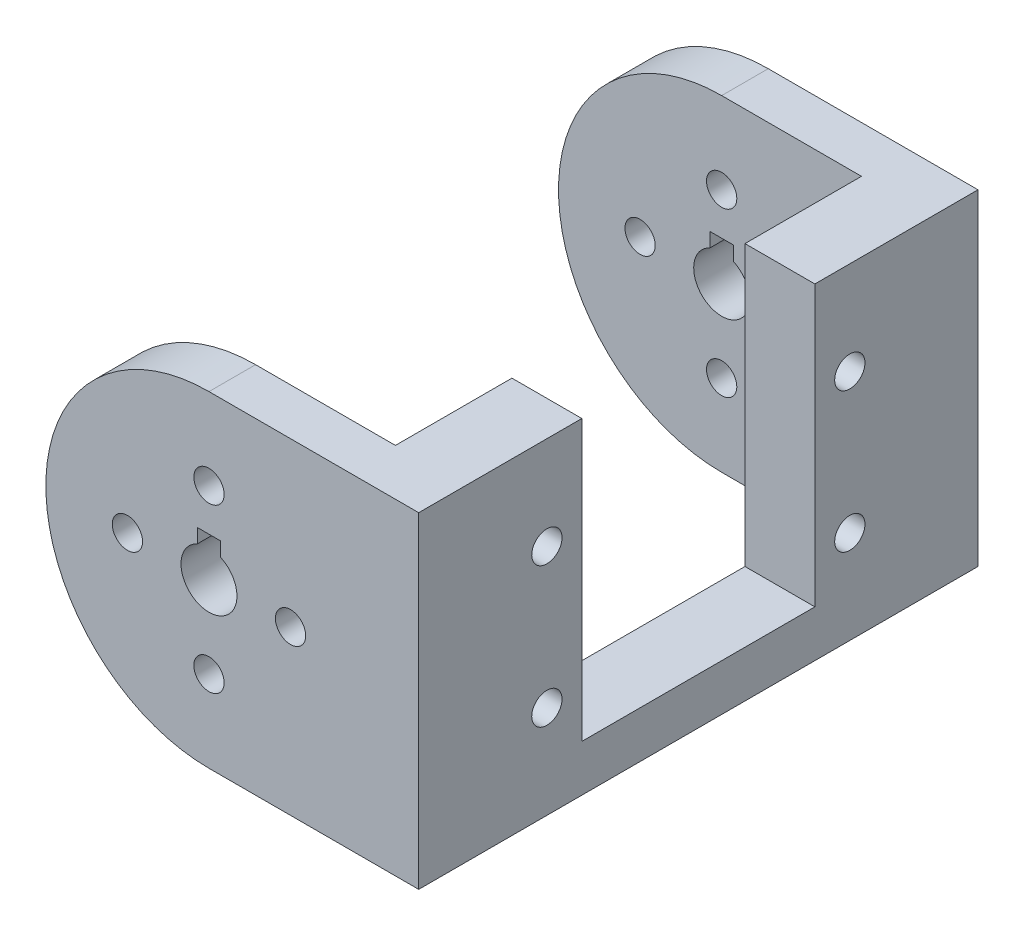
ISO-10303-21;
HEADER;
FILE_DESCRIPTION(('STEP AP214'),'2;1');
FILE_NAME('part.step','',(''),(''),'','','');
FILE_SCHEMA(('AUTOMOTIVE_DESIGN { 1 0 10303 214 1 1 1 1 }'));
ENDSEC;
DATA;
#1=APPLICATION_CONTEXT('core data for automotive mechanical design processes');
#2=APPLICATION_PROTOCOL_DEFINITION('international standard','automotive_design',2000,#1);
#3=PRODUCT_CONTEXT('',#1,'mechanical');
#4=PRODUCT('Part','Part','',(#3));
#5=PRODUCT_RELATED_PRODUCT_CATEGORY('part','',(#4));
#6=PRODUCT_DEFINITION_FORMATION('','',#4);
#7=PRODUCT_DEFINITION_CONTEXT('part definition',#1,'design');
#8=PRODUCT_DEFINITION('design','',#6,#7);
#9=PRODUCT_DEFINITION_SHAPE('','',#8);
#10=(LENGTH_UNIT() NAMED_UNIT(*) SI_UNIT(.MILLI.,.METRE.));
#11=(NAMED_UNIT(*) PLANE_ANGLE_UNIT() SI_UNIT($,.RADIAN.));
#12=(NAMED_UNIT(*) SI_UNIT($,.STERADIAN.) SOLID_ANGLE_UNIT());
#13=UNCERTAINTY_MEASURE_WITH_UNIT(LENGTH_MEASURE(1.E-05),#10,'distance_accuracy_value','');
#14=(GEOMETRIC_REPRESENTATION_CONTEXT(3) GLOBAL_UNCERTAINTY_ASSIGNED_CONTEXT((#13)) GLOBAL_UNIT_ASSIGNED_CONTEXT((#10,
#11,#12)) REPRESENTATION_CONTEXT('',''));
#15=CARTESIAN_POINT('',(0.,0.,0.));
#16=DIRECTION('',(0.,0.,1.));
#17=DIRECTION('',(1.,0.,0.));
#18=AXIS2_PLACEMENT_3D('',#15,#16,#17);
#19=CARTESIAN_POINT('',(0.,35.,0.));
#20=DIRECTION('',(0.,1.,0.));
#21=DIRECTION('',(0.,0.,1.));
#22=AXIS2_PLACEMENT_3D('',#19,#20,#21);
#23=PLANE('',#22);
#24=DIRECTION('',(1.,0.,0.));
#25=VECTOR('',#24,1.);
#26=CARTESIAN_POINT('',(0.,35.,25.));
#27=LINE('',#26,#25);
#28=CARTESIAN_POINT('',(25.,35.,25.));
#29=VERTEX_POINT('',#28);
#30=CARTESIAN_POINT('',(40.,35.,25.));
#31=VERTEX_POINT('',#30);
#32=EDGE_CURVE('E11',#29,#31,#27,.T.);
#33=ORIENTED_EDGE('',*,*,#32,.F.);
#34=DIRECTION('',(0.,0.,-1.));
#35=VECTOR('',#34,1.);
#36=CARTESIAN_POINT('',(25.,35.,0.));
#37=LINE('',#36,#35);
#38=CARTESIAN_POINT('',(25.,35.,50.));
#39=VERTEX_POINT('',#38);
#40=EDGE_CURVE('E394',#39,#29,#37,.T.);
#41=ORIENTED_EDGE('',*,*,#40,.F.);
#42=DIRECTION('',(1.,0.,0.));
#43=VECTOR('',#42,1.);
#44=CARTESIAN_POINT('',(0.,35.,50.));
#45=LINE('',#44,#43);
#46=CARTESIAN_POINT('',(-4.99999999999999,35.,50.));
#47=VERTEX_POINT('',#46);
#48=EDGE_CURVE('E209',#47,#39,#45,.T.);
#49=ORIENTED_EDGE('',*,*,#48,.F.);
#50=DIRECTION('',(0.,0.,-1.));
#51=VECTOR('',#50,1.);
#52=CARTESIAN_POINT('',(-4.99999999999999,35.,50.));
#53=LINE('',#52,#51);
#54=CARTESIAN_POINT('',(-4.99999999999999,35.,60.));
#55=VERTEX_POINT('',#54);
#56=EDGE_CURVE('E241',#47,#55,#53,.F.);
#57=ORIENTED_EDGE('',*,*,#56,.T.);
#58=DIRECTION('',(1.,0.,0.));
#59=VECTOR('',#58,1.);
#60=CARTESIAN_POINT('',(0.,35.,60.));
#61=LINE('',#60,#59);
#62=CARTESIAN_POINT('',(40.,35.,60.));
#63=VERTEX_POINT('',#62);
#64=EDGE_CURVE('E203',#55,#63,#61,.T.);
#65=ORIENTED_EDGE('',*,*,#64,.T.);
#66=DIRECTION('',(0.,0.,1.));
#67=VECTOR('',#66,1.);
#68=CARTESIAN_POINT('',(40.,35.,0.));
#69=LINE('',#68,#67);
#70=EDGE_CURVE('E196',#31,#63,#69,.T.);
#71=ORIENTED_EDGE('',*,*,#70,.F.);
#72=EDGE_LOOP('',(#33,#41,#49,#57,#65,#71));
#73=FACE_BOUND('',#72,.T.);
#74=ADVANCED_FACE('F43',(#73),#23,.T.);
#75=CARTESIAN_POINT('',(-5.,0.,-50.));
#76=DIRECTION('',(0.,0.,1.));
#77=DIRECTION('',(1.,0.,0.));
#78=AXIS2_PLACEMENT_3D('',#75,#76,#77);
#79=CYLINDRICAL_SURFACE('',#78,35.);
#80=DIRECTION('',(0.,0.,1.));
#81=VECTOR('',#80,1.);
#82=CARTESIAN_POINT('',(-5.,-35.,0.));
#83=LINE('',#82,#81);
#84=CARTESIAN_POINT('',(-5.,-35.,-50.));
#85=VERTEX_POINT('',#84);
#86=CARTESIAN_POINT('',(-5.,-35.,-60.));
#87=VERTEX_POINT('',#86);
#88=EDGE_CURVE('E250',#85,#87,#83,.F.);
#89=ORIENTED_EDGE('',*,*,#88,.F.);
#90=CARTESIAN_POINT('',(-5.,0.,-50.));
#91=DIRECTION('',(0.,0.,1.));
#92=DIRECTION('',(1.,0.,0.));
#93=AXIS2_PLACEMENT_3D('',#90,#91,#92);
#94=CIRCLE('',#93,35.);
#95=CARTESIAN_POINT('',(-5.,35.,-50.));
#96=VERTEX_POINT('',#95);
#97=EDGE_CURVE('E256',#96,#85,#94,.T.);
#98=ORIENTED_EDGE('',*,*,#97,.F.);
#99=DIRECTION('',(0.,0.,-1.));
#100=VECTOR('',#99,1.);
#101=CARTESIAN_POINT('',(-5.,35.,-50.));
#102=LINE('',#101,#100);
#103=CARTESIAN_POINT('',(-5.,35.,-60.));
#104=VERTEX_POINT('',#103);
#105=EDGE_CURVE('E253',#104,#96,#102,.F.);
#106=ORIENTED_EDGE('',*,*,#105,.F.);
#107=CARTESIAN_POINT('',(-5.00000000000001,0.,-60.));
#108=DIRECTION('',(0.,0.,-1.));
#109=DIRECTION('',(-1.,0.,0.));
#110=AXIS2_PLACEMENT_3D('',#107,#108,#109);
#111=CIRCLE('',#110,35.);
#112=EDGE_CURVE('E258',#87,#104,#111,.T.);
#113=ORIENTED_EDGE('',*,*,#112,.F.);
#114=EDGE_LOOP('',(#89,#98,#106,#113));
#115=FACE_BOUND('',#114,.T.);
#116=ADVANCED_FACE('F46',(#115),#79,.T.);
#117=CARTESIAN_POINT('',(-4.99999999999999,0.,50.));
#118=DIRECTION('',(0.,0.,1.));
#119=DIRECTION('',(1.,0.,0.));
#120=AXIS2_PLACEMENT_3D('',#117,#118,#119);
#121=CYLINDRICAL_SURFACE('',#120,35.);
#122=ORIENTED_EDGE('',*,*,#56,.F.);
#123=CARTESIAN_POINT('',(-4.99999999999999,0.,50.));
#124=DIRECTION('',(0.,0.,-1.));
#125=DIRECTION('',(-1.,0.,0.));
#126=AXIS2_PLACEMENT_3D('',#123,#124,#125);
#127=CIRCLE('',#126,35.);
#128=CARTESIAN_POINT('',(-4.99999999999999,-35.,50.));
#129=VERTEX_POINT('',#128);
#130=EDGE_CURVE('E246',#129,#47,#127,.T.);
#131=ORIENTED_EDGE('',*,*,#130,.F.);
#132=DIRECTION('',(0.,0.,1.));
#133=VECTOR('',#132,1.);
#134=CARTESIAN_POINT('',(-5.,-35.,0.));
#135=LINE('',#134,#133);
#136=CARTESIAN_POINT('',(-4.99999999999999,-35.,60.));
#137=VERTEX_POINT('',#136);
#138=EDGE_CURVE('E243',#137,#129,#135,.F.);
#139=ORIENTED_EDGE('',*,*,#138,.F.);
#140=CARTESIAN_POINT('',(-4.99999999999999,0.,60.));
#141=DIRECTION('',(0.,0.,-1.));
#142=DIRECTION('',(-1.,0.,0.));
#143=AXIS2_PLACEMENT_3D('',#140,#141,#142);
#144=CIRCLE('',#143,35.);
#145=EDGE_CURVE('E248',#55,#137,#144,.F.);
#146=ORIENTED_EDGE('',*,*,#145,.F.);
#147=EDGE_LOOP('',(#122,#131,#139,#146));
#148=FACE_BOUND('',#147,.T.);
#149=ADVANCED_FACE('F411',(#148),#121,.T.);
#150=CARTESIAN_POINT('',(0.,35.,-50.));
#151=DIRECTION('',(0.,0.,1.));
#152=DIRECTION('',(1.,0.,0.));
#153=AXIS2_PLACEMENT_3D('',#150,#151,#152);
#154=PLANE('',#153);
#155=CARTESIAN_POINT('',(12.5,0.,-50.));
#156=DIRECTION('',(0.,0.,1.));
#157=DIRECTION('',(1.,0.,0.));
#158=AXIS2_PLACEMENT_3D('',#155,#156,#157);
#159=CIRCLE('',#158,3.25);
#160=CARTESIAN_POINT('',(15.75,0.,-50.));
#161=VERTEX_POINT('',#160);
#162=EDGE_CURVE('E321',#161,#161,#159,.T.);
#163=ORIENTED_EDGE('',*,*,#162,.F.);
#164=EDGE_LOOP('',(#163));
#165=FACE_BOUND('',#164,.T.);
#166=CARTESIAN_POINT('',(-4.99999999999998,-17.5,-50.));
#167=DIRECTION('',(0.,0.,1.));
#168=DIRECTION('',(1.,0.,0.));
#169=AXIS2_PLACEMENT_3D('',#166,#167,#168);
#170=CIRCLE('',#169,3.25);
#171=CARTESIAN_POINT('',(-1.74999999999997,-17.5,-50.));
#172=VERTEX_POINT('',#171);
#173=EDGE_CURVE('E315',#172,#172,#170,.T.);
#174=ORIENTED_EDGE('',*,*,#173,.F.);
#175=EDGE_LOOP('',(#174));
#176=FACE_BOUND('',#175,.T.);
#177=CARTESIAN_POINT('',(-22.5,1.83013326715553E-13,-50.));
#178=DIRECTION('',(0.,0.,1.));
#179=DIRECTION('',(1.,0.,0.));
#180=AXIS2_PLACEMENT_3D('',#177,#178,#179);
#181=CIRCLE('',#180,3.25);
#182=CARTESIAN_POINT('',(-19.25,1.83013326715553E-13,-50.));
#183=VERTEX_POINT('',#182);
#184=EDGE_CURVE('E309',#183,#183,#181,.T.);
#185=ORIENTED_EDGE('',*,*,#184,.F.);
#186=EDGE_LOOP('',(#185));
#187=FACE_BOUND('',#186,.T.);
#188=CARTESIAN_POINT('',(-4.99999999999998,17.5,-50.));
#189=DIRECTION('',(0.,0.,1.));
#190=DIRECTION('',(1.,0.,0.));
#191=AXIS2_PLACEMENT_3D('',#188,#189,#190);
#192=CIRCLE('',#191,3.25);
#193=CARTESIAN_POINT('',(-1.74999999999997,17.5,-50.));
#194=VERTEX_POINT('',#193);
#195=EDGE_CURVE('E333',#194,#194,#192,.T.);
#196=ORIENTED_EDGE('',*,*,#195,.F.);
#197=EDGE_LOOP('',(#196));
#198=FACE_BOUND('',#197,.T.);
#199=DIRECTION('',(0.,-1.,0.));
#200=VECTOR('',#199,1.);
#201=CARTESIAN_POINT('',(-7.49999999999998,35.,-50.));
#202=LINE('',#201,#200);
#203=CARTESIAN_POINT('',(-7.49999999999998,8.5,-50.));
#204=VERTEX_POINT('',#203);
#205=CARTESIAN_POINT('',(-7.49999999999998,5.45435605731786,-50.));
#206=VERTEX_POINT('',#205);
#207=EDGE_CURVE('E219',#204,#206,#202,.T.);
#208=ORIENTED_EDGE('',*,*,#207,.F.);
#209=DIRECTION('',(1.,0.,0.));
#210=VECTOR('',#209,1.);
#211=CARTESIAN_POINT('',(0.,8.5,-50.));
#212=LINE('',#211,#210);
#213=CARTESIAN_POINT('',(-2.49999999999997,8.5,-50.));
#214=VERTEX_POINT('',#213);
#215=EDGE_CURVE('E385',#204,#214,#212,.T.);
#216=ORIENTED_EDGE('',*,*,#215,.T.);
#217=DIRECTION('',(0.,-1.,0.));
#218=VECTOR('',#217,1.);
#219=CARTESIAN_POINT('',(-2.49999999999997,35.,-50.));
#220=LINE('',#219,#218);
#221=CARTESIAN_POINT('',(-2.49999999999997,5.45435605731786,-50.));
#222=VERTEX_POINT('',#221);
#223=EDGE_CURVE('E379',#214,#222,#220,.T.);
#224=ORIENTED_EDGE('',*,*,#223,.T.);
#225=CARTESIAN_POINT('',(-4.99999999999998,0.,-50.));
#226=DIRECTION('',(0.,0.,1.));
#227=DIRECTION('',(1.,0.,0.));
#228=AXIS2_PLACEMENT_3D('',#225,#226,#227);
#229=CIRCLE('',#228,6.);
#230=EDGE_CURVE('E374',#206,#222,#229,.T.);
#231=ORIENTED_EDGE('',*,*,#230,.F.);
#232=EDGE_LOOP('',(#208,#216,#224,#231));
#233=FACE_BOUND('',#232,.T.);
#234=DIRECTION('',(-1.,0.,0.));
#235=VECTOR('',#234,1.);
#236=CARTESIAN_POINT('',(0.,35.,-50.));
#237=LINE('',#236,#235);
#238=CARTESIAN_POINT('',(25.,35.,-50.));
#239=VERTEX_POINT('',#238);
#240=EDGE_CURVE('E231',#239,#96,#237,.T.);
#241=ORIENTED_EDGE('',*,*,#240,.T.);
#242=ORIENTED_EDGE('',*,*,#97,.T.);
#243=DIRECTION('',(-1.,0.,0.));
#244=VECTOR('',#243,1.);
#245=CARTESIAN_POINT('',(0.,-35.,-50.));
#246=LINE('',#245,#244);
#247=CARTESIAN_POINT('',(25.,-35.,-50.));
#248=VERTEX_POINT('',#247);
#249=EDGE_CURVE('E215',#248,#85,#246,.T.);
#250=ORIENTED_EDGE('',*,*,#249,.F.);
#251=DIRECTION('',(0.,-1.,0.));
#252=VECTOR('',#251,1.);
#253=CARTESIAN_POINT('',(25.,35.,-50.));
#254=LINE('',#253,#252);
#255=EDGE_CURVE('E239',#239,#248,#254,.T.);
#256=ORIENTED_EDGE('',*,*,#255,.F.);
#257=EDGE_LOOP('',(#241,#242,#250,#256));
#258=FACE_BOUND('',#257,.T.);
#259=ADVANCED_FACE('F476',(#165,#176,#187,#198,#233,#258),#154,.T.);
#260=CARTESIAN_POINT('',(25.,35.,0.));
#261=DIRECTION('',(-1.,0.,0.));
#262=DIRECTION('',(0.,0.,1.));
#263=AXIS2_PLACEMENT_3D('',#260,#261,#262);
#264=PLANE('',#263);
#265=CARTESIAN_POINT('',(25.,15.,32.5));
#266=DIRECTION('',(-1.,0.,0.));
#267=DIRECTION('',(0.,0.,1.));
#268=AXIS2_PLACEMENT_3D('',#265,#266,#267);
#269=CIRCLE('',#268,3.25);
#270=CARTESIAN_POINT('',(25.,15.,35.75));
#271=VERTEX_POINT('',#270);
#272=EDGE_CURVE('E870',#271,#271,#269,.T.);
#273=ORIENTED_EDGE('',*,*,#272,.F.);
#274=EDGE_LOOP('',(#273));
#275=FACE_BOUND('',#274,.T.);
#276=CARTESIAN_POINT('',(25.,-15.,32.5));
#277=DIRECTION('',(-1.,0.,0.));
#278=DIRECTION('',(0.,0.,1.));
#279=AXIS2_PLACEMENT_3D('',#276,#277,#278);
#280=CIRCLE('',#279,3.25);
#281=CARTESIAN_POINT('',(25.,-15.,35.75));
#282=VERTEX_POINT('',#281);
#283=EDGE_CURVE('E871',#282,#282,#280,.T.);
#284=ORIENTED_EDGE('',*,*,#283,.F.);
#285=EDGE_LOOP('',(#284));
#286=FACE_BOUND('',#285,.T.);
#287=CARTESIAN_POINT('',(25.,-15.,-32.5));
#288=DIRECTION('',(-1.,0.,0.));
#289=DIRECTION('',(0.,0.,1.));
#290=AXIS2_PLACEMENT_3D('',#287,#288,#289);
#291=CIRCLE('',#290,3.25);
#292=CARTESIAN_POINT('',(25.,-15.,-29.25));
#293=VERTEX_POINT('',#292);
#294=EDGE_CURVE('E873',#293,#293,#291,.T.);
#295=ORIENTED_EDGE('',*,*,#294,.F.);
#296=EDGE_LOOP('',(#295));
#297=FACE_BOUND('',#296,.T.);
#298=CARTESIAN_POINT('',(25.,15.,-32.5));
#299=DIRECTION('',(-1.,0.,0.));
#300=DIRECTION('',(0.,0.,1.));
#301=AXIS2_PLACEMENT_3D('',#298,#299,#300);
#302=CIRCLE('',#301,3.25);
#303=CARTESIAN_POINT('',(25.,15.,-29.25));
#304=VERTEX_POINT('',#303);
#305=EDGE_CURVE('E265',#304,#304,#302,.T.);
#306=ORIENTED_EDGE('',*,*,#305,.F.);
#307=EDGE_LOOP('',(#306));
#308=FACE_BOUND('',#307,.T.);
#309=DIRECTION('',(0.,1.,0.));
#310=VECTOR('',#309,1.);
#311=CARTESIAN_POINT('',(25.,35.,25.));
#312=LINE('',#311,#310);
#313=CARTESIAN_POINT('',(25.,-25.,25.));
#314=VERTEX_POINT('',#313);
#315=EDGE_CURVE('E188',#314,#29,#312,.T.);
#316=ORIENTED_EDGE('',*,*,#315,.F.);
#317=DIRECTION('',(0.,0.,1.));
#318=VECTOR('',#317,1.);
#319=CARTESIAN_POINT('',(25.,-25.,0.));
#320=LINE('',#319,#318);
#321=CARTESIAN_POINT('',(25.,-25.,-25.));
#322=VERTEX_POINT('',#321);
#323=EDGE_CURVE('E286',#322,#314,#320,.T.);
#324=ORIENTED_EDGE('',*,*,#323,.F.);
#325=DIRECTION('',(0.,-1.,0.));
#326=VECTOR('',#325,1.);
#327=CARTESIAN_POINT('',(25.,35.,-25.));
#328=LINE('',#327,#326);
#329=CARTESIAN_POINT('',(25.,35.,-25.));
#330=VERTEX_POINT('',#329);
#331=EDGE_CURVE('E282',#330,#322,#328,.T.);
#332=ORIENTED_EDGE('',*,*,#331,.F.);
#333=EDGE_CURVE('E393',#330,#239,#37,.T.);
#334=ORIENTED_EDGE('',*,*,#333,.T.);
#335=ORIENTED_EDGE('',*,*,#255,.T.);
#336=DIRECTION('',(0.,0.,-1.));
#337=VECTOR('',#336,1.);
#338=CARTESIAN_POINT('',(25.,-35.,0.));
#339=LINE('',#338,#337);
#340=CARTESIAN_POINT('',(25.,-35.,50.));
#341=VERTEX_POINT('',#340);
#342=EDGE_CURVE('E218',#341,#248,#339,.T.);
#343=ORIENTED_EDGE('',*,*,#342,.F.);
#344=DIRECTION('',(0.,-1.,0.));
#345=VECTOR('',#344,1.);
#346=CARTESIAN_POINT('',(25.,35.,50.));
#347=LINE('',#346,#345);
#348=EDGE_CURVE('E236',#39,#341,#347,.T.);
#349=ORIENTED_EDGE('',*,*,#348,.F.);
#350=ORIENTED_EDGE('',*,*,#40,.T.);
#351=EDGE_LOOP('',(#316,#324,#332,#334,#335,#343,#349,#350));
#352=FACE_BOUND('',#351,.T.);
#353=ADVANCED_FACE('F403',(#275,#286,#297,#308,#352),#264,.T.);
#354=CARTESIAN_POINT('',(0.,35.,50.));
#355=DIRECTION('',(0.,0.,-1.));
#356=DIRECTION('',(-1.,0.,0.));
#357=AXIS2_PLACEMENT_3D('',#354,#355,#356);
#358=PLANE('',#357);
#359=CARTESIAN_POINT('',(12.5,0.,50.));
#360=DIRECTION('',(0.,0.,-1.));
#361=DIRECTION('',(-1.,0.,0.));
#362=AXIS2_PLACEMENT_3D('',#359,#360,#361);
#363=CIRCLE('',#362,3.25);
#364=CARTESIAN_POINT('',(9.25000000000002,0.,50.));
#365=VERTEX_POINT('',#364);
#366=EDGE_CURVE('E318',#365,#365,#363,.T.);
#367=ORIENTED_EDGE('',*,*,#366,.F.);
#368=EDGE_LOOP('',(#367));
#369=FACE_BOUND('',#368,.T.);
#370=CARTESIAN_POINT('',(-4.99999999999998,-17.5,50.));
#371=DIRECTION('',(0.,0.,-1.));
#372=DIRECTION('',(-1.,0.,0.));
#373=AXIS2_PLACEMENT_3D('',#370,#371,#372);
#374=CIRCLE('',#373,3.25);
#375=CARTESIAN_POINT('',(-8.24999999999998,-17.5,50.));
#376=VERTEX_POINT('',#375);
#377=EDGE_CURVE('E312',#376,#376,#374,.T.);
#378=ORIENTED_EDGE('',*,*,#377,.F.);
#379=EDGE_LOOP('',(#378));
#380=FACE_BOUND('',#379,.T.);
#381=CARTESIAN_POINT('',(-22.5,1.83013326715553E-13,50.));
#382=DIRECTION('',(0.,0.,-1.));
#383=DIRECTION('',(-1.,0.,0.));
#384=AXIS2_PLACEMENT_3D('',#381,#382,#383);
#385=CIRCLE('',#384,3.25);
#386=CARTESIAN_POINT('',(-25.75,1.83013326715553E-13,50.));
#387=VERTEX_POINT('',#386);
#388=EDGE_CURVE('E292',#387,#387,#385,.T.);
#389=ORIENTED_EDGE('',*,*,#388,.F.);
#390=EDGE_LOOP('',(#389));
#391=FACE_BOUND('',#390,.T.);
#392=CARTESIAN_POINT('',(-4.99999999999998,17.5,50.));
#393=DIRECTION('',(0.,0.,-1.));
#394=DIRECTION('',(-1.,0.,0.));
#395=AXIS2_PLACEMENT_3D('',#392,#393,#394);
#396=CIRCLE('',#395,3.25);
#397=CARTESIAN_POINT('',(-8.24999999999998,17.5,50.));
#398=VERTEX_POINT('',#397);
#399=EDGE_CURVE('E328',#398,#398,#396,.T.);
#400=ORIENTED_EDGE('',*,*,#399,.F.);
#401=EDGE_LOOP('',(#400));
#402=FACE_BOUND('',#401,.T.);
#403=DIRECTION('',(0.,1.,0.));
#404=VECTOR('',#403,1.);
#405=CARTESIAN_POINT('',(-7.49999999999998,35.,50.));
#406=LINE('',#405,#404);
#407=CARTESIAN_POINT('',(-7.49999999999998,5.45435605731786,50.));
#408=VERTEX_POINT('',#407);
#409=CARTESIAN_POINT('',(-7.49999999999998,8.5,50.));
#410=VERTEX_POINT('',#409);
#411=EDGE_CURVE('E388',#408,#410,#406,.T.);
#412=ORIENTED_EDGE('',*,*,#411,.F.);
#413=CARTESIAN_POINT('',(-4.99999999999998,0.,50.));
#414=DIRECTION('',(0.,0.,-1.));
#415=DIRECTION('',(-1.,0.,0.));
#416=AXIS2_PLACEMENT_3D('',#413,#414,#415);
#417=CIRCLE('',#416,6.);
#418=CARTESIAN_POINT('',(-2.49999999999997,5.45435605731786,50.));
#419=VERTEX_POINT('',#418);
#420=EDGE_CURVE('E362',#419,#408,#417,.T.);
#421=ORIENTED_EDGE('',*,*,#420,.F.);
#422=DIRECTION('',(0.,1.,0.));
#423=VECTOR('',#422,1.);
#424=CARTESIAN_POINT('',(-2.49999999999997,35.,50.));
#425=LINE('',#424,#423);
#426=CARTESIAN_POINT('',(-2.49999999999997,8.5,50.));
#427=VERTEX_POINT('',#426);
#428=EDGE_CURVE('E376',#419,#427,#425,.T.);
#429=ORIENTED_EDGE('',*,*,#428,.T.);
#430=DIRECTION('',(-1.,0.,0.));
#431=VECTOR('',#430,1.);
#432=CARTESIAN_POINT('',(0.,8.5,50.));
#433=LINE('',#432,#431);
#434=EDGE_CURVE('E382',#427,#410,#433,.T.);
#435=ORIENTED_EDGE('',*,*,#434,.T.);
#436=EDGE_LOOP('',(#412,#421,#429,#435));
#437=FACE_BOUND('',#436,.T.);
#438=DIRECTION('',(1.,0.,0.));
#439=VECTOR('',#438,1.);
#440=CARTESIAN_POINT('',(0.,-35.,50.));
#441=LINE('',#440,#439);
#442=EDGE_CURVE('E222',#129,#341,#441,.T.);
#443=ORIENTED_EDGE('',*,*,#442,.F.);
#444=ORIENTED_EDGE('',*,*,#130,.T.);
#445=ORIENTED_EDGE('',*,*,#48,.T.);
#446=ORIENTED_EDGE('',*,*,#348,.T.);
#447=EDGE_LOOP('',(#443,#444,#445,#446));
#448=FACE_BOUND('',#447,.T.);
#449=ADVANCED_FACE('F399',(#369,#380,#391,#402,#437,#448),#358,.T.);
#450=CARTESIAN_POINT('',(0.,35.,60.));
#451=DIRECTION('',(0.,0.,-1.));
#452=DIRECTION('',(-1.,0.,0.));
#453=AXIS2_PLACEMENT_3D('',#450,#451,#452);
#454=PLANE('',#453);
#455=CARTESIAN_POINT('',(12.5,0.,60.));
#456=DIRECTION('',(0.,0.,1.));
#457=DIRECTION('',(0.,-1.,0.));
#458=AXIS2_PLACEMENT_3D('',#455,#456,#457);
#459=CIRCLE('',#458,3.25);
#460=CARTESIAN_POINT('',(12.5,-3.25000000000006,60.));
#461=VERTEX_POINT('',#460);
#462=EDGE_CURVE('E293',#461,#461,#459,.T.);
#463=ORIENTED_EDGE('',*,*,#462,.F.);
#464=EDGE_LOOP('',(#463));
#465=FACE_BOUND('',#464,.T.);
#466=CARTESIAN_POINT('',(-4.99999999999998,-17.5,60.));
#467=DIRECTION('',(0.,0.,1.));
#468=DIRECTION('',(-1.,0.,0.));
#469=AXIS2_PLACEMENT_3D('',#466,#467,#468);
#470=CIRCLE('',#469,3.25);
#471=CARTESIAN_POINT('',(-8.24999999999998,-17.5,60.));
#472=VERTEX_POINT('',#471);
#473=EDGE_CURVE('E299',#472,#472,#470,.T.);
#474=ORIENTED_EDGE('',*,*,#473,.F.);
#475=EDGE_LOOP('',(#474));
#476=FACE_BOUND('',#475,.T.);
#477=CARTESIAN_POINT('',(-22.5,1.83013326715553E-13,60.));
#478=DIRECTION('',(0.,0.,1.));
#479=DIRECTION('',(0.,1.,0.));
#480=AXIS2_PLACEMENT_3D('',#477,#478,#479);
#481=CIRCLE('',#480,3.25);
#482=CARTESIAN_POINT('',(-22.4999999999999,3.25000000000018,60.));
#483=VERTEX_POINT('',#482);
#484=EDGE_CURVE('E288',#483,#483,#481,.T.);
#485=ORIENTED_EDGE('',*,*,#484,.F.);
#486=EDGE_LOOP('',(#485));
#487=FACE_BOUND('',#486,.T.);
#488=CARTESIAN_POINT('',(-4.99999999999998,17.5,60.));
#489=DIRECTION('',(0.,0.,1.));
#490=DIRECTION('',(1.,0.,0.));
#491=AXIS2_PLACEMENT_3D('',#488,#489,#490);
#492=CIRCLE('',#491,3.25);
#493=CARTESIAN_POINT('',(-1.74999999999997,17.5,60.));
#494=VERTEX_POINT('',#493);
#495=EDGE_CURVE('E324',#494,#494,#492,.T.);
#496=ORIENTED_EDGE('',*,*,#495,.F.);
#497=EDGE_LOOP('',(#496));
#498=FACE_BOUND('',#497,.T.);
#499=CARTESIAN_POINT('',(-4.99999999999998,0.,60.));
#500=DIRECTION('',(0.,0.,1.));
#501=DIRECTION('',(1.,0.,0.));
#502=AXIS2_PLACEMENT_3D('',#499,#500,#501);
#503=CIRCLE('',#502,6.);
#504=CARTESIAN_POINT('',(-7.49999999999998,5.45435605731786,60.));
#505=VERTEX_POINT('',#504);
#506=CARTESIAN_POINT('',(-2.49999999999997,5.45435605731786,60.));
#507=VERTEX_POINT('',#506);
#508=EDGE_CURVE('E351',#505,#507,#503,.T.);
#509=ORIENTED_EDGE('',*,*,#508,.F.);
#510=DIRECTION('',(0.,-1.,0.));
#511=VECTOR('',#510,1.);
#512=CARTESIAN_POINT('',(-7.49999999999998,0.,60.));
#513=LINE('',#512,#511);
#514=CARTESIAN_POINT('',(-7.49999999999998,8.5,60.));
#515=VERTEX_POINT('',#514);
#516=EDGE_CURVE('E336',#515,#505,#513,.T.);
#517=ORIENTED_EDGE('',*,*,#516,.F.);
#518=DIRECTION('',(1.,0.,0.));
#519=VECTOR('',#518,1.);
#520=CARTESIAN_POINT('',(0.,8.5,60.));
#521=LINE('',#520,#519);
#522=CARTESIAN_POINT('',(-2.49999999999997,8.5,60.));
#523=VERTEX_POINT('',#522);
#524=EDGE_CURVE('E341',#515,#523,#521,.T.);
#525=ORIENTED_EDGE('',*,*,#524,.T.);
#526=DIRECTION('',(0.,-1.,0.));
#527=VECTOR('',#526,1.);
#528=CARTESIAN_POINT('',(-2.49999999999997,0.,60.));
#529=LINE('',#528,#527);
#530=EDGE_CURVE('E354',#523,#507,#529,.T.);
#531=ORIENTED_EDGE('',*,*,#530,.T.);
#532=EDGE_LOOP('',(#509,#517,#525,#531));
#533=FACE_BOUND('',#532,.T.);
#534=ORIENTED_EDGE('',*,*,#64,.F.);
#535=ORIENTED_EDGE('',*,*,#145,.T.);
#536=DIRECTION('',(1.,0.,0.));
#537=VECTOR('',#536,1.);
#538=CARTESIAN_POINT('',(0.,-35.,60.));
#539=LINE('',#538,#537);
#540=CARTESIAN_POINT('',(40.,-35.,60.));
#541=VERTEX_POINT('',#540);
#542=EDGE_CURVE('E224',#137,#541,#539,.T.);
#543=ORIENTED_EDGE('',*,*,#542,.T.);
#544=DIRECTION('',(0.,-1.,0.));
#545=VECTOR('',#544,1.);
#546=CARTESIAN_POINT('',(40.,35.,60.));
#547=LINE('',#546,#545);
#548=EDGE_CURVE('E234',#63,#541,#547,.T.);
#549=ORIENTED_EDGE('',*,*,#548,.F.);
#550=EDGE_LOOP('',(#534,#535,#543,#549));
#551=FACE_BOUND('',#550,.T.);
#552=ADVANCED_FACE('F413',(#465,#476,#487,#498,#533,#551),#454,.F.);
#553=CARTESIAN_POINT('',(40.,35.,0.));
#554=DIRECTION('',(1.,0.,0.));
#555=DIRECTION('',(0.,0.,-1.));
#556=AXIS2_PLACEMENT_3D('',#553,#554,#555);
#557=PLANE('',#556);
#558=CARTESIAN_POINT('',(40.,15.,32.5));
#559=DIRECTION('',(1.,0.,0.));
#560=DIRECTION('',(0.,0.,-1.));
#561=AXIS2_PLACEMENT_3D('',#558,#559,#560);
#562=CIRCLE('',#561,3.25);
#563=CARTESIAN_POINT('',(40.,15.,29.25));
#564=VERTEX_POINT('',#563);
#565=EDGE_CURVE('E48',#564,#564,#562,.T.);
#566=ORIENTED_EDGE('',*,*,#565,.F.);
#567=EDGE_LOOP('',(#566));
#568=FACE_BOUND('',#567,.T.);
#569=CARTESIAN_POINT('',(40.,-15.,32.5));
#570=DIRECTION('',(1.,0.,0.));
#571=DIRECTION('',(0.,0.,-1.));
#572=AXIS2_PLACEMENT_3D('',#569,#570,#571);
#573=CIRCLE('',#572,3.25);
#574=CARTESIAN_POINT('',(40.,-15.,29.25));
#575=VERTEX_POINT('',#574);
#576=EDGE_CURVE('E267',#575,#575,#573,.T.);
#577=ORIENTED_EDGE('',*,*,#576,.F.);
#578=EDGE_LOOP('',(#577));
#579=FACE_BOUND('',#578,.T.);
#580=CARTESIAN_POINT('',(40.,-15.,-32.5));
#581=DIRECTION('',(1.,0.,0.));
#582=DIRECTION('',(0.,0.,-1.));
#583=AXIS2_PLACEMENT_3D('',#580,#581,#582);
#584=CIRCLE('',#583,3.25);
#585=CARTESIAN_POINT('',(40.,-15.,-35.75));
#586=VERTEX_POINT('',#585);
#587=EDGE_CURVE('E264',#586,#586,#584,.T.);
#588=ORIENTED_EDGE('',*,*,#587,.F.);
#589=EDGE_LOOP('',(#588));
#590=FACE_BOUND('',#589,.T.);
#591=CARTESIAN_POINT('',(40.,15.,-32.5));
#592=DIRECTION('',(1.,0.,0.));
#593=DIRECTION('',(0.,0.,-1.));
#594=AXIS2_PLACEMENT_3D('',#591,#592,#593);
#595=CIRCLE('',#594,3.25);
#596=CARTESIAN_POINT('',(40.,15.,-35.75));
#597=VERTEX_POINT('',#596);
#598=EDGE_CURVE('E261',#597,#597,#595,.T.);
#599=ORIENTED_EDGE('',*,*,#598,.F.);
#600=EDGE_LOOP('',(#599));
#601=FACE_BOUND('',#600,.T.);
#602=DIRECTION('',(0.,-1.,0.));
#603=VECTOR('',#602,1.);
#604=CARTESIAN_POINT('',(40.,25.,25.));
#605=LINE('',#604,#603);
#606=CARTESIAN_POINT('',(40.,-25.,25.));
#607=VERTEX_POINT('',#606);
#608=EDGE_CURVE('E185',#31,#607,#605,.T.);
#609=ORIENTED_EDGE('',*,*,#608,.F.);
#610=ORIENTED_EDGE('',*,*,#70,.T.);
#611=ORIENTED_EDGE('',*,*,#548,.T.);
#612=DIRECTION('',(0.,0.,1.));
#613=VECTOR('',#612,1.);
#614=CARTESIAN_POINT('',(40.,-35.,0.));
#615=LINE('',#614,#613);
#616=CARTESIAN_POINT('',(40.,-35.,-60.));
#617=VERTEX_POINT('',#616);
#618=EDGE_CURVE('E226',#617,#541,#615,.T.);
#619=ORIENTED_EDGE('',*,*,#618,.F.);
#620=DIRECTION('',(0.,-1.,0.));
#621=VECTOR('',#620,1.);
#622=CARTESIAN_POINT('',(40.,35.,-60.));
#623=LINE('',#622,#621);
#624=CARTESIAN_POINT('',(40.,35.,-60.));
#625=VERTEX_POINT('',#624);
#626=EDGE_CURVE('E214',#625,#617,#623,.T.);
#627=ORIENTED_EDGE('',*,*,#626,.F.);
#628=CARTESIAN_POINT('',(40.,35.,-25.));
#629=VERTEX_POINT('',#628);
#630=EDGE_CURVE('E205',#625,#629,#69,.T.);
#631=ORIENTED_EDGE('',*,*,#630,.T.);
#632=DIRECTION('',(0.,1.,0.));
#633=VECTOR('',#632,1.);
#634=CARTESIAN_POINT('',(40.,35.,-25.));
#635=LINE('',#634,#633);
#636=CARTESIAN_POINT('',(40.,-25.,-25.));
#637=VERTEX_POINT('',#636);
#638=EDGE_CURVE('E61',#637,#629,#635,.T.);
#639=ORIENTED_EDGE('',*,*,#638,.F.);
#640=DIRECTION('',(0.,0.,-1.));
#641=VECTOR('',#640,1.);
#642=CARTESIAN_POINT('',(40.,-25.,25.));
#643=LINE('',#642,#641);
#644=EDGE_CURVE('E199',#607,#637,#643,.T.);
#645=ORIENTED_EDGE('',*,*,#644,.F.);
#646=EDGE_LOOP('',(#609,#610,#611,#619,#627,#631,#639,#645));
#647=FACE_BOUND('',#646,.T.);
#648=ADVANCED_FACE('F194',(#568,#579,#590,#601,#647),#557,.T.);
#649=CARTESIAN_POINT('',(0.,35.,-60.));
#650=DIRECTION('',(0.,0.,-1.));
#651=DIRECTION('',(-1.,0.,0.));
#652=AXIS2_PLACEMENT_3D('',#649,#650,#651);
#653=PLANE('',#652);
#654=CARTESIAN_POINT('',(12.5,0.,-60.));
#655=DIRECTION('',(0.,0.,1.));
#656=DIRECTION('',(0.,-1.,0.));
#657=AXIS2_PLACEMENT_3D('',#654,#655,#656);
#658=CIRCLE('',#657,3.25);
#659=CARTESIAN_POINT('',(12.5,-3.25000000000006,-60.));
#660=VERTEX_POINT('',#659);
#661=EDGE_CURVE('E289',#660,#660,#658,.T.);
#662=ORIENTED_EDGE('',*,*,#661,.T.);
#663=EDGE_LOOP('',(#662));
#664=FACE_BOUND('',#663,.T.);
#665=CARTESIAN_POINT('',(-4.99999999999998,-17.5,-60.));
#666=DIRECTION('',(0.,0.,1.));
#667=DIRECTION('',(-1.,0.,0.));
#668=AXIS2_PLACEMENT_3D('',#665,#666,#667);
#669=CIRCLE('',#668,3.25);
#670=CARTESIAN_POINT('',(-8.24999999999998,-17.5,-60.));
#671=VERTEX_POINT('',#670);
#672=EDGE_CURVE('E296',#671,#671,#669,.T.);
#673=ORIENTED_EDGE('',*,*,#672,.T.);
#674=EDGE_LOOP('',(#673));
#675=FACE_BOUND('',#674,.T.);
#676=CARTESIAN_POINT('',(-22.5,1.83013326715553E-13,-60.));
#677=DIRECTION('',(0.,0.,1.));
#678=DIRECTION('',(0.,1.,0.));
#679=AXIS2_PLACEMENT_3D('',#676,#677,#678);
#680=CIRCLE('',#679,3.25);
#681=CARTESIAN_POINT('',(-22.4999999999999,3.25000000000018,-60.));
#682=VERTEX_POINT('',#681);
#683=EDGE_CURVE('E302',#682,#682,#680,.T.);
#684=ORIENTED_EDGE('',*,*,#683,.T.);
#685=EDGE_LOOP('',(#684));
#686=FACE_BOUND('',#685,.T.);
#687=CARTESIAN_POINT('',(-4.99999999999998,17.5,-60.));
#688=DIRECTION('',(0.,0.,1.));
#689=DIRECTION('',(1.,0.,0.));
#690=AXIS2_PLACEMENT_3D('',#687,#688,#689);
#691=CIRCLE('',#690,3.25);
#692=CARTESIAN_POINT('',(-1.74999999999997,17.5,-60.));
#693=VERTEX_POINT('',#692);
#694=EDGE_CURVE('E325',#693,#693,#691,.T.);
#695=ORIENTED_EDGE('',*,*,#694,.T.);
#696=EDGE_LOOP('',(#695));
#697=FACE_BOUND('',#696,.T.);
#698=DIRECTION('',(0.,-1.,0.));
#699=VECTOR('',#698,1.);
#700=CARTESIAN_POINT('',(-7.49999999999998,0.,-60.));
#701=LINE('',#700,#699);
#702=CARTESIAN_POINT('',(-7.49999999999998,8.5,-60.));
#703=VERTEX_POINT('',#702);
#704=CARTESIAN_POINT('',(-7.49999999999998,5.45435605731786,-60.));
#705=VERTEX_POINT('',#704);
#706=EDGE_CURVE('E337',#703,#705,#701,.T.);
#707=ORIENTED_EDGE('',*,*,#706,.T.);
#708=CARTESIAN_POINT('',(-4.99999999999998,0.,-60.));
#709=DIRECTION('',(0.,0.,1.));
#710=DIRECTION('',(1.,0.,0.));
#711=AXIS2_PLACEMENT_3D('',#708,#709,#710);
#712=CIRCLE('',#711,6.);
#713=CARTESIAN_POINT('',(-2.49999999999997,5.45435605731786,-60.));
#714=VERTEX_POINT('',#713);
#715=EDGE_CURVE('E340',#705,#714,#712,.T.);
#716=ORIENTED_EDGE('',*,*,#715,.T.);
#717=DIRECTION('',(0.,-1.,0.));
#718=VECTOR('',#717,1.);
#719=CARTESIAN_POINT('',(-2.49999999999997,0.,-60.));
#720=LINE('',#719,#718);
#721=CARTESIAN_POINT('',(-2.49999999999997,8.5,-60.));
#722=VERTEX_POINT('',#721);
#723=EDGE_CURVE('E344',#722,#714,#720,.T.);
#724=ORIENTED_EDGE('',*,*,#723,.F.);
#725=DIRECTION('',(1.,0.,0.));
#726=VECTOR('',#725,1.);
#727=CARTESIAN_POINT('',(0.,8.5,-60.));
#728=LINE('',#727,#726);
#729=EDGE_CURVE('E347',#703,#722,#728,.T.);
#730=ORIENTED_EDGE('',*,*,#729,.F.);
#731=EDGE_LOOP('',(#707,#716,#724,#730));
#732=FACE_BOUND('',#731,.T.);
#733=DIRECTION('',(1.,0.,0.));
#734=VECTOR('',#733,1.);
#735=CARTESIAN_POINT('',(0.,-35.,-60.));
#736=LINE('',#735,#734);
#737=EDGE_CURVE('E229',#87,#617,#736,.T.);
#738=ORIENTED_EDGE('',*,*,#737,.F.);
#739=ORIENTED_EDGE('',*,*,#112,.T.);
#740=DIRECTION('',(1.,0.,0.));
#741=VECTOR('',#740,1.);
#742=CARTESIAN_POINT('',(0.,35.,-60.));
#743=LINE('',#742,#741);
#744=EDGE_CURVE('E208',#104,#625,#743,.T.);
#745=ORIENTED_EDGE('',*,*,#744,.T.);
#746=ORIENTED_EDGE('',*,*,#626,.T.);
#747=EDGE_LOOP('',(#738,#739,#745,#746));
#748=FACE_BOUND('',#747,.T.);
#749=ADVANCED_FACE('F419',(#664,#675,#686,#697,#732,#748),#653,.T.);
#750=DIRECTION('',(-1.,0.,0.));
#751=VECTOR('',#750,1.);
#752=CARTESIAN_POINT('',(0.,35.,-25.));
#753=LINE('',#752,#751);
#754=EDGE_CURVE('E53',#629,#330,#753,.T.);
#755=ORIENTED_EDGE('',*,*,#754,.F.);
#756=ORIENTED_EDGE('',*,*,#630,.F.);
#757=ORIENTED_EDGE('',*,*,#744,.F.);
#758=ORIENTED_EDGE('',*,*,#105,.T.);
#759=ORIENTED_EDGE('',*,*,#240,.F.);
#760=ORIENTED_EDGE('',*,*,#333,.F.);
#761=EDGE_LOOP('',(#755,#756,#757,#758,#759,#760));
#762=FACE_BOUND('',#761,.T.);
#763=ADVANCED_FACE('F423',(#762),#23,.T.);
#764=CARTESIAN_POINT('',(0.,-35.,0.));
#765=DIRECTION('',(0.,1.,0.));
#766=DIRECTION('',(0.,0.,1.));
#767=AXIS2_PLACEMENT_3D('',#764,#765,#766);
#768=PLANE('',#767);
#769=ORIENTED_EDGE('',*,*,#249,.T.);
#770=ORIENTED_EDGE('',*,*,#88,.T.);
#771=ORIENTED_EDGE('',*,*,#737,.T.);
#772=ORIENTED_EDGE('',*,*,#618,.T.);
#773=ORIENTED_EDGE('',*,*,#542,.F.);
#774=ORIENTED_EDGE('',*,*,#138,.T.);
#775=ORIENTED_EDGE('',*,*,#442,.T.);
#776=ORIENTED_EDGE('',*,*,#342,.T.);
#777=EDGE_LOOP('',(#769,#770,#771,#772,#773,#774,#775,#776));
#778=FACE_BOUND('',#777,.T.);
#779=ADVANCED_FACE('F407',(#778),#768,.F.);
#780=CARTESIAN_POINT('',(-4.99999999999998,0.,-60.));
#781=DIRECTION('',(0.,0.,1.));
#782=DIRECTION('',(1.,0.,0.));
#783=AXIS2_PLACEMENT_3D('',#780,#781,#782);
#784=CYLINDRICAL_SURFACE('',#783,6.);
#785=ORIENTED_EDGE('',*,*,#230,.T.);
#786=DIRECTION('',(0.,0.,1.));
#787=VECTOR('',#786,1.);
#788=CARTESIAN_POINT('',(-2.49999999999997,5.45435605731786,-60.));
#789=LINE('',#788,#787);
#790=EDGE_CURVE('E368',#714,#222,#789,.T.);
#791=ORIENTED_EDGE('',*,*,#790,.F.);
#792=ORIENTED_EDGE('',*,*,#715,.F.);
#793=DIRECTION('',(0.,0.,1.));
#794=VECTOR('',#793,1.);
#795=CARTESIAN_POINT('',(-7.49999999999998,5.45435605731786,-60.));
#796=LINE('',#795,#794);
#797=EDGE_CURVE('E69',#705,#206,#796,.T.);
#798=ORIENTED_EDGE('',*,*,#797,.T.);
#799=EDGE_LOOP('',(#785,#791,#792,#798));
#800=FACE_BOUND('',#799,.T.);
#801=ADVANCED_FACE('F458',(#800),#784,.F.);
#802=CARTESIAN_POINT('',(-2.49999999999997,0.,-60.));
#803=DIRECTION('',(-1.,0.,0.));
#804=DIRECTION('',(0.,0.,1.));
#805=AXIS2_PLACEMENT_3D('',#802,#803,#804);
#806=PLANE('',#805);
#807=DIRECTION('',(0.,0.,1.));
#808=VECTOR('',#807,1.);
#809=CARTESIAN_POINT('',(-2.49999999999997,8.5,-60.));
#810=LINE('',#809,#808);
#811=EDGE_CURVE('E364',#722,#214,#810,.T.);
#812=ORIENTED_EDGE('',*,*,#811,.F.);
#813=ORIENTED_EDGE('',*,*,#723,.T.);
#814=ORIENTED_EDGE('',*,*,#790,.T.);
#815=ORIENTED_EDGE('',*,*,#223,.F.);
#816=EDGE_LOOP('',(#812,#813,#814,#815));
#817=FACE_BOUND('',#816,.T.);
#818=ADVANCED_FACE('F674',(#817),#806,.T.);
#819=CARTESIAN_POINT('',(0.,8.5,-60.));
#820=DIRECTION('',(0.,-1.,0.));
#821=DIRECTION('',(0.,0.,-1.));
#822=AXIS2_PLACEMENT_3D('',#819,#820,#821);
#823=PLANE('',#822);
#824=DIRECTION('',(0.,0.,1.));
#825=VECTOR('',#824,1.);
#826=CARTESIAN_POINT('',(-7.49999999999998,8.5,-60.));
#827=LINE('',#826,#825);
#828=EDGE_CURVE('E359',#703,#204,#827,.T.);
#829=ORIENTED_EDGE('',*,*,#828,.F.);
#830=ORIENTED_EDGE('',*,*,#729,.T.);
#831=ORIENTED_EDGE('',*,*,#811,.T.);
#832=ORIENTED_EDGE('',*,*,#215,.F.);
#833=EDGE_LOOP('',(#829,#830,#831,#832));
#834=FACE_BOUND('',#833,.T.);
#835=ADVANCED_FACE('F685',(#834),#823,.T.);
#836=CARTESIAN_POINT('',(-7.49999999999998,0.,-60.));
#837=DIRECTION('',(-1.,0.,0.));
#838=DIRECTION('',(0.,0.,1.));
#839=AXIS2_PLACEMENT_3D('',#836,#837,#838);
#840=PLANE('',#839);
#841=ORIENTED_EDGE('',*,*,#207,.T.);
#842=ORIENTED_EDGE('',*,*,#797,.F.);
#843=ORIENTED_EDGE('',*,*,#706,.F.);
#844=ORIENTED_EDGE('',*,*,#828,.T.);
#845=EDGE_LOOP('',(#841,#842,#843,#844));
#846=FACE_BOUND('',#845,.T.);
#847=ADVANCED_FACE('F693',(#846),#840,.F.);
#848=ORIENTED_EDGE('',*,*,#411,.T.);
#849=EDGE_CURVE('E363',#410,#515,#827,.T.);
#850=ORIENTED_EDGE('',*,*,#849,.T.);
#851=ORIENTED_EDGE('',*,*,#516,.T.);
#852=EDGE_CURVE('E349',#408,#505,#796,.T.);
#853=ORIENTED_EDGE('',*,*,#852,.F.);
#854=EDGE_LOOP('',(#848,#850,#851,#853));
#855=FACE_BOUND('',#854,.T.);
#856=ADVANCED_FACE('F682',(#855),#840,.F.);
#857=EDGE_CURVE('E367',#427,#523,#810,.T.);
#858=ORIENTED_EDGE('',*,*,#857,.T.);
#859=ORIENTED_EDGE('',*,*,#524,.F.);
#860=ORIENTED_EDGE('',*,*,#849,.F.);
#861=ORIENTED_EDGE('',*,*,#434,.F.);
#862=EDGE_LOOP('',(#858,#859,#860,#861));
#863=FACE_BOUND('',#862,.T.);
#864=ADVANCED_FACE('F671',(#863),#823,.T.);
#865=EDGE_CURVE('E371',#419,#507,#789,.T.);
#866=ORIENTED_EDGE('',*,*,#865,.T.);
#867=ORIENTED_EDGE('',*,*,#530,.F.);
#868=ORIENTED_EDGE('',*,*,#857,.F.);
#869=ORIENTED_EDGE('',*,*,#428,.F.);
#870=EDGE_LOOP('',(#866,#867,#868,#869));
#871=FACE_BOUND('',#870,.T.);
#872=ADVANCED_FACE('F661',(#871),#806,.T.);
#873=ORIENTED_EDGE('',*,*,#420,.T.);
#874=ORIENTED_EDGE('',*,*,#852,.T.);
#875=ORIENTED_EDGE('',*,*,#508,.T.);
#876=ORIENTED_EDGE('',*,*,#865,.F.);
#877=EDGE_LOOP('',(#873,#874,#875,#876));
#878=FACE_BOUND('',#877,.T.);
#879=ADVANCED_FACE('F652',(#878),#784,.F.);
#880=CARTESIAN_POINT('',(-4.99999999999998,17.5,-60.));
#881=DIRECTION('',(0.,0.,1.));
#882=DIRECTION('',(1.,0.,0.));
#883=AXIS2_PLACEMENT_3D('',#880,#881,#882);
#884=CYLINDRICAL_SURFACE('',#883,3.25);
#885=ORIENTED_EDGE('',*,*,#195,.T.);
#886=EDGE_LOOP('',(#885));
#887=FACE_BOUND('',#886,.T.);
#888=ORIENTED_EDGE('',*,*,#694,.F.);
#889=EDGE_LOOP('',(#888));
#890=FACE_BOUND('',#889,.T.);
#891=ADVANCED_FACE('F643',(#887,#890),#884,.F.);
#892=ORIENTED_EDGE('',*,*,#399,.T.);
#893=EDGE_LOOP('',(#892));
#894=FACE_BOUND('',#893,.T.);
#895=ORIENTED_EDGE('',*,*,#495,.T.);
#896=EDGE_LOOP('',(#895));
#897=FACE_BOUND('',#896,.T.);
#898=ADVANCED_FACE('F634',(#894,#897),#884,.F.);
#899=CARTESIAN_POINT('',(-22.5,1.83013326715553E-13,-60.));
#900=DIRECTION('',(0.,0.,1.));
#901=DIRECTION('',(1.,0.,0.));
#902=AXIS2_PLACEMENT_3D('',#899,#900,#901);
#903=CYLINDRICAL_SURFACE('',#902,3.25);
#904=ORIENTED_EDGE('',*,*,#184,.T.);
#905=EDGE_LOOP('',(#904));
#906=FACE_BOUND('',#905,.T.);
#907=ORIENTED_EDGE('',*,*,#683,.F.);
#908=EDGE_LOOP('',(#907));
#909=FACE_BOUND('',#908,.T.);
#910=ADVANCED_FACE('F610',(#906,#909),#903,.F.);
#911=CARTESIAN_POINT('',(-4.99999999999998,-17.5,-60.));
#912=DIRECTION('',(0.,0.,1.));
#913=DIRECTION('',(1.,0.,0.));
#914=AXIS2_PLACEMENT_3D('',#911,#912,#913);
#915=CYLINDRICAL_SURFACE('',#914,3.25);
#916=ORIENTED_EDGE('',*,*,#173,.T.);
#917=EDGE_LOOP('',(#916));
#918=FACE_BOUND('',#917,.T.);
#919=ORIENTED_EDGE('',*,*,#672,.F.);
#920=EDGE_LOOP('',(#919));
#921=FACE_BOUND('',#920,.T.);
#922=ADVANCED_FACE('F600',(#918,#921),#915,.F.);
#923=CARTESIAN_POINT('',(12.5,0.,-60.));
#924=DIRECTION('',(0.,0.,1.));
#925=DIRECTION('',(1.,0.,0.));
#926=AXIS2_PLACEMENT_3D('',#923,#924,#925);
#927=CYLINDRICAL_SURFACE('',#926,3.25);
#928=ORIENTED_EDGE('',*,*,#162,.T.);
#929=EDGE_LOOP('',(#928));
#930=FACE_BOUND('',#929,.T.);
#931=ORIENTED_EDGE('',*,*,#661,.F.);
#932=EDGE_LOOP('',(#931));
#933=FACE_BOUND('',#932,.T.);
#934=ADVANCED_FACE('F443',(#930,#933),#927,.F.);
#935=ORIENTED_EDGE('',*,*,#388,.T.);
#936=EDGE_LOOP('',(#935));
#937=FACE_BOUND('',#936,.T.);
#938=ORIENTED_EDGE('',*,*,#484,.T.);
#939=EDGE_LOOP('',(#938));
#940=FACE_BOUND('',#939,.T.);
#941=ADVANCED_FACE('F597',(#937,#940),#903,.F.);
#942=ORIENTED_EDGE('',*,*,#377,.T.);
#943=EDGE_LOOP('',(#942));
#944=FACE_BOUND('',#943,.T.);
#945=ORIENTED_EDGE('',*,*,#473,.T.);
#946=EDGE_LOOP('',(#945));
#947=FACE_BOUND('',#946,.T.);
#948=ADVANCED_FACE('F440',(#944,#947),#915,.F.);
#949=ORIENTED_EDGE('',*,*,#366,.T.);
#950=EDGE_LOOP('',(#949));
#951=FACE_BOUND('',#950,.T.);
#952=ORIENTED_EDGE('',*,*,#462,.T.);
#953=EDGE_LOOP('',(#952));
#954=FACE_BOUND('',#953,.T.);
#955=ADVANCED_FACE('F433',(#951,#954),#927,.F.);
#956=CARTESIAN_POINT('',(-40.,-25.,25.));
#957=DIRECTION('',(0.,-1.,0.));
#958=DIRECTION('',(0.,0.,-1.));
#959=AXIS2_PLACEMENT_3D('',#956,#957,#958);
#960=PLANE('',#959);
#961=ORIENTED_EDGE('',*,*,#323,.T.);
#962=DIRECTION('',(1.,0.,0.));
#963=VECTOR('',#962,1.);
#964=CARTESIAN_POINT('',(-40.,-25.,25.));
#965=LINE('',#964,#963);
#966=EDGE_CURVE('E279',#314,#607,#965,.T.);
#967=ORIENTED_EDGE('',*,*,#966,.T.);
#968=ORIENTED_EDGE('',*,*,#644,.T.);
#969=DIRECTION('',(1.,0.,0.));
#970=VECTOR('',#969,1.);
#971=CARTESIAN_POINT('',(-40.,-25.,-25.));
#972=LINE('',#971,#970);
#973=EDGE_CURVE('E280',#322,#637,#972,.T.);
#974=ORIENTED_EDGE('',*,*,#973,.F.);
#975=EDGE_LOOP('',(#961,#967,#968,#974));
#976=FACE_BOUND('',#975,.T.);
#977=ADVANCED_FACE('F431',(#976),#960,.F.);
#978=CARTESIAN_POINT('',(-40.,25.,25.));
#979=DIRECTION('',(0.,0.,1.));
#980=DIRECTION('',(1.,0.,0.));
#981=AXIS2_PLACEMENT_3D('',#978,#979,#980);
#982=PLANE('',#981);
#983=ORIENTED_EDGE('',*,*,#315,.T.);
#984=ORIENTED_EDGE('',*,*,#32,.T.);
#985=ORIENTED_EDGE('',*,*,#608,.T.);
#986=ORIENTED_EDGE('',*,*,#966,.F.);
#987=EDGE_LOOP('',(#983,#984,#985,#986));
#988=FACE_BOUND('',#987,.T.);
#989=ADVANCED_FACE('F183',(#988),#982,.F.);
#990=CARTESIAN_POINT('',(-40.,35.,-25.));
#991=DIRECTION('',(0.,0.,-1.));
#992=DIRECTION('',(0.,1.,0.));
#993=AXIS2_PLACEMENT_3D('',#990,#991,#992);
#994=PLANE('',#993);
#995=ORIENTED_EDGE('',*,*,#331,.T.);
#996=ORIENTED_EDGE('',*,*,#973,.T.);
#997=ORIENTED_EDGE('',*,*,#638,.T.);
#998=ORIENTED_EDGE('',*,*,#754,.T.);
#999=EDGE_LOOP('',(#995,#996,#997,#998));
#1000=FACE_BOUND('',#999,.T.);
#1001=ADVANCED_FACE('F427',(#1000),#994,.F.);
#1002=CARTESIAN_POINT('',(48.,15.,-32.5));
#1003=DIRECTION('',(-1.,0.,0.));
#1004=DIRECTION('',(0.,0.,1.));
#1005=AXIS2_PLACEMENT_3D('',#1002,#1003,#1004);
#1006=CYLINDRICAL_SURFACE('',#1005,3.25);
#1007=ORIENTED_EDGE('',*,*,#598,.T.);
#1008=EDGE_LOOP('',(#1007));
#1009=FACE_BOUND('',#1008,.T.);
#1010=ORIENTED_EDGE('',*,*,#305,.T.);
#1011=EDGE_LOOP('',(#1010));
#1012=FACE_BOUND('',#1011,.T.);
#1013=ADVANCED_FACE('F517',(#1009,#1012),#1006,.F.);
#1014=CARTESIAN_POINT('',(48.,-15.,-32.5));
#1015=DIRECTION('',(-1.,0.,0.));
#1016=DIRECTION('',(0.,0.,1.));
#1017=AXIS2_PLACEMENT_3D('',#1014,#1015,#1016);
#1018=CYLINDRICAL_SURFACE('',#1017,3.25);
#1019=ORIENTED_EDGE('',*,*,#587,.T.);
#1020=EDGE_LOOP('',(#1019));
#1021=FACE_BOUND('',#1020,.T.);
#1022=ORIENTED_EDGE('',*,*,#294,.T.);
#1023=EDGE_LOOP('',(#1022));
#1024=FACE_BOUND('',#1023,.T.);
#1025=ADVANCED_FACE('F522',(#1021,#1024),#1018,.F.);
#1026=CARTESIAN_POINT('',(48.,-15.,32.5));
#1027=DIRECTION('',(-1.,0.,0.));
#1028=DIRECTION('',(0.,0.,1.));
#1029=AXIS2_PLACEMENT_3D('',#1026,#1027,#1028);
#1030=CYLINDRICAL_SURFACE('',#1029,3.25);
#1031=ORIENTED_EDGE('',*,*,#576,.T.);
#1032=EDGE_LOOP('',(#1031));
#1033=FACE_BOUND('',#1032,.T.);
#1034=ORIENTED_EDGE('',*,*,#283,.T.);
#1035=EDGE_LOOP('',(#1034));
#1036=FACE_BOUND('',#1035,.T.);
#1037=ADVANCED_FACE('F534',(#1033,#1036),#1030,.F.);
#1038=CARTESIAN_POINT('',(48.,15.,32.5));
#1039=DIRECTION('',(-1.,0.,0.));
#1040=DIRECTION('',(0.,0.,1.));
#1041=AXIS2_PLACEMENT_3D('',#1038,#1039,#1040);
#1042=CYLINDRICAL_SURFACE('',#1041,3.25);
#1043=ORIENTED_EDGE('',*,*,#565,.T.);
#1044=EDGE_LOOP('',(#1043));
#1045=FACE_BOUND('',#1044,.T.);
#1046=ORIENTED_EDGE('',*,*,#272,.T.);
#1047=EDGE_LOOP('',(#1046));
#1048=FACE_BOUND('',#1047,.T.);
#1049=ADVANCED_FACE('F545',(#1045,#1048),#1042,.F.);
#1050=CLOSED_SHELL('',(#74,#116,#149,#259,#353,#449,#552,#648,#749,#763,#779,#801,#818,#835,
#847,#856,#864,#872,#879,#891,#898,#910,#922,#934,#941,#948,#955,#977,#989,#1001,#1013,#1025,
#1037,#1049));
#1051=MANIFOLD_SOLID_BREP('B2',#1050);
#1052=ADVANCED_BREP_SHAPE_REPRESENTATION('',(#18,#1051),#14);
#1053=SHAPE_DEFINITION_REPRESENTATION(#9,#1052);
ENDSEC;
END-ISO-10303-21;
